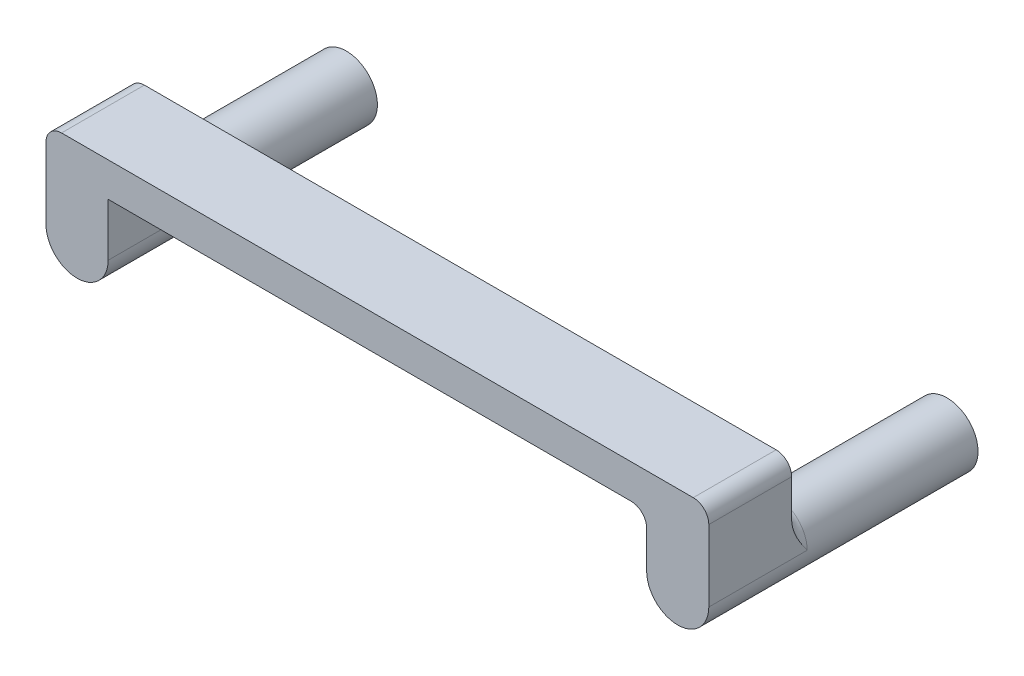
ISO-10303-21;
HEADER;
FILE_DESCRIPTION(('STEP AP214'),'2;1');
FILE_NAME('part.step','',(''),(''),'','','');
FILE_SCHEMA(('AUTOMOTIVE_DESIGN { 1 0 10303 214 1 1 1 1 }'));
ENDSEC;
DATA;
#1=APPLICATION_CONTEXT('core data for automotive mechanical design processes');
#2=APPLICATION_PROTOCOL_DEFINITION('international standard','automotive_design',2000,#1);
#3=PRODUCT_CONTEXT('',#1,'mechanical');
#4=PRODUCT('Part','Part','',(#3));
#5=PRODUCT_RELATED_PRODUCT_CATEGORY('part','',(#4));
#6=PRODUCT_DEFINITION_FORMATION('','',#4);
#7=PRODUCT_DEFINITION_CONTEXT('part definition',#1,'design');
#8=PRODUCT_DEFINITION('design','',#6,#7);
#9=PRODUCT_DEFINITION_SHAPE('','',#8);
#10=(LENGTH_UNIT() NAMED_UNIT(*) SI_UNIT(.MILLI.,.METRE.));
#11=(NAMED_UNIT(*) PLANE_ANGLE_UNIT() SI_UNIT($,.RADIAN.));
#12=(NAMED_UNIT(*) SI_UNIT($,.STERADIAN.) SOLID_ANGLE_UNIT());
#13=UNCERTAINTY_MEASURE_WITH_UNIT(LENGTH_MEASURE(1.E-05),#10,'distance_accuracy_value','');
#14=(GEOMETRIC_REPRESENTATION_CONTEXT(3) GLOBAL_UNCERTAINTY_ASSIGNED_CONTEXT((#13)) GLOBAL_UNIT_ASSIGNED_CONTEXT((#10,
#11,#12)) REPRESENTATION_CONTEXT('',''));
#15=CARTESIAN_POINT('',(0.,0.,0.));
#16=DIRECTION('',(0.,0.,1.));
#17=DIRECTION('',(1.,0.,0.));
#18=AXIS2_PLACEMENT_3D('',#15,#16,#17);
#19=CARTESIAN_POINT('',(-9.99999999999998,60.9,0.));
#20=DIRECTION('',(1.,0.,0.));
#21=DIRECTION('',(0.,0.,-1.));
#22=AXIS2_PLACEMENT_3D('',#19,#20,#21);
#23=PLANE('',#22);
#24=DIRECTION('',(0.,-1.,0.));
#25=VECTOR('',#24,1.);
#26=CARTESIAN_POINT('',(-9.99999999999999,60.9,-56.9370698042326));
#27=LINE('',#26,#25);
#28=CARTESIAN_POINT('',(-9.99999999999999,59.4,-56.9370698042326));
#29=VERTEX_POINT('',#28);
#30=CARTESIAN_POINT('',(-9.99999999999999,52.50000168,-56.9370698042326));
#31=VERTEX_POINT('',#30);
#32=EDGE_CURVE('E166',#29,#31,#27,.T.);
#33=ORIENTED_EDGE('',*,*,#32,.F.);
#34=DIRECTION('',(0.,0.,1.));
#35=VECTOR('',#34,1.);
#36=CARTESIAN_POINT('',(-10.,59.4,-64.9370698042326));
#37=LINE('',#36,#35);
#38=CARTESIAN_POINT('',(-10.,59.4,-64.9370698042326));
#39=VERTEX_POINT('',#38);
#40=EDGE_CURVE('E281',#29,#39,#37,.F.);
#41=ORIENTED_EDGE('',*,*,#40,.T.);
#42=DIRECTION('',(0.,-1.,0.));
#43=VECTOR('',#42,1.);
#44=CARTESIAN_POINT('',(-10.,60.9,-64.9370698042326));
#45=LINE('',#44,#43);
#46=CARTESIAN_POINT('',(-10.,55.8541049521128,-64.9370698042326));
#47=VERTEX_POINT('',#46);
#48=EDGE_CURVE('E246',#39,#47,#45,.T.);
#49=ORIENTED_EDGE('',*,*,#48,.T.);
#50=CARTESIAN_POINT('',(-10.,55.8541049521128,-64.9370698042326));
#51=CARTESIAN_POINT('',(-10.0000000000216,55.7651154626738,-64.9370745959461));
#52=CARTESIAN_POINT('',(-10.0000000000108,55.6762126022973,-64.9414664773992));
#53=CARTESIAN_POINT('',(-9.99999999998921,55.4992948734416,-64.9580952538092));
#54=CARTESIAN_POINT('',(-9.99999999997845,55.4112786786405,-64.9703177913225));
#55=CARTESIAN_POINT('',(-10.0000000000212,55.2378021048105,-65.0014552321768));
#56=CARTESIAN_POINT('',(-10.0000000000738,55.1523231740385,-65.0202692748518));
#57=CARTESIAN_POINT('',(-9.99999999992613,54.9828516014592,-65.0638136754254));
#58=CARTESIAN_POINT('',(-9.99999999972568,54.8988598912561,-65.0885476099306));
#59=CARTESIAN_POINT('',(-10.0000000005999,54.6338606954235,-65.1755873368162));
#60=CARTESIAN_POINT('',(-10.0000000034705,54.4560333562481,-65.2476423714991));
#61=CARTESIAN_POINT('',(-9.99999999652462,54.1086185838798,-65.4093753327334));
#62=CARTESIAN_POINT('',(-9.99999998669028,53.9390431356483,-65.4990779905247));
#63=CARTESIAN_POINT('',(-10.0000000134214,53.6054044645602,-65.691076549084));
#64=CARTESIAN_POINT('',(-10.0000000503772,53.4413994689193,-65.7934718496725));
#65=CARTESIAN_POINT('',(-9.99999994964333,53.1181729631041,-66.0052672807827));
#66=CARTESIAN_POINT('',(-9.99999981202489,52.9589495316917,-66.1146645410495));
#67=CARTESIAN_POINT('',(-10.0000000289543,52.7762311692729,-66.2423521131087));
#68=CARTESIAN_POINT('',(-10.0000000656336,52.7518643345087,-66.2594245923119));
#69=CARTESIAN_POINT('',(-9.99999993436467,52.7031942128421,-66.2936622887846));
#70=CARTESIAN_POINT('',(-9.99999976641105,52.6788909276215,-66.3108275084721));
#71=CARTESIAN_POINT('',(-10.0000002332627,52.6302228048735,-66.3449954933492));
#72=CARTESIAN_POINT('',(-10.0000008669469,52.6058581007391,-66.3619984519649));
#73=CARTESIAN_POINT('',(-9.99999913334557,52.5576012796665,-66.3966681153818));
#74=CARTESIAN_POINT('',(-9.9999967670724,52.5337090060455,-66.4143345942913));
#75=CARTESIAN_POINT('',(-10.0000003975836,52.5060856266609,-66.4330250808685));
#76=CARTESIAN_POINT('',(-10.0000008798491,52.5030498646338,-66.4350564394132));
#77=CARTESIAN_POINT('',(-10.00000146,52.50000168,-66.4370698042326));
#78=B_SPLINE_CURVE_WITH_KNOTS('',3,(#50,#51,#52,#53,#54,#55,#56,#57,#58,#59,#60,#61,#62,#63,#64,
#65,#66,#67,#68,#69,#70,#71,#72,#73,#74,#75,#76,#77),.UNSPECIFIED.,.F.,.F.,(4,2,2,2,2,2,2,2,2,2,
2,2,2,4),(0.,0.266735554078513,0.532983444887629,0.795323468027049,1.05782239037541,
1.63189767728831,2.20678327428957,2.78649511016045,3.36597081296184,3.45522892799344,
3.54448938162114,3.63362515636196,3.72273085562599,3.73368902329409),.UNSPECIFIED.);
#79=CARTESIAN_POINT('',(-10.,52.50000168,-66.4370698042326));
#80=VERTEX_POINT('',#79);
#81=EDGE_CURVE('E298',#47,#80,#78,.T.);
#82=ORIENTED_EDGE('',*,*,#81,.T.);
#83=DIRECTION('',(0.,0.,-1.));
#84=VECTOR('',#83,1.);
#85=CARTESIAN_POINT('',(-9.99999999999999,52.50000168,-56.9370698042326));
#86=LINE('',#85,#84);
#87=EDGE_CURVE('E179',#31,#80,#86,.T.);
#88=ORIENTED_EDGE('',*,*,#87,.F.);
#89=EDGE_LOOP('',(#33,#41,#49,#82,#88));
#90=FACE_BOUND('',#89,.T.);
#91=ADVANCED_FACE('F59',(#90),#23,.F.);
#92=CARTESIAN_POINT('',(0.,60.9,-56.9370698042326));
#93=DIRECTION('',(0.,0.,-1.));
#94=DIRECTION('',(0.,1.,0.));
#95=AXIS2_PLACEMENT_3D('',#92,#93,#94);
#96=PLANE('',#95);
#97=DIRECTION('',(1.,0.,0.));
#98=VECTOR('',#97,1.);
#99=CARTESIAN_POINT('',(0.,60.9,-56.9370698042326));
#100=LINE('',#99,#98);
#101=CARTESIAN_POINT('',(-8.49999999999999,60.9,-56.9370698042326));
#102=VERTEX_POINT('',#101);
#103=CARTESIAN_POINT('',(52.5,60.9,-56.9370698042326));
#104=VERTEX_POINT('',#103);
#105=EDGE_CURVE('E239',#102,#104,#100,.T.);
#106=ORIENTED_EDGE('',*,*,#105,.F.);
#107=CARTESIAN_POINT('',(-8.49999999999999,59.4,-56.9370698042326));
#108=DIRECTION('',(0.,0.,-1.));
#109=DIRECTION('',(0.,1.,0.));
#110=AXIS2_PLACEMENT_3D('',#107,#108,#109);
#111=CIRCLE('',#110,1.5);
#112=EDGE_CURVE('E279',#102,#29,#111,.F.);
#113=ORIENTED_EDGE('',*,*,#112,.T.);
#114=ORIENTED_EDGE('',*,*,#32,.T.);
#115=CARTESIAN_POINT('',(-7.00000145999998,52.50000168,-56.9370698042326));
#116=DIRECTION('',(0.,0.,-1.));
#117=DIRECTION('',(-1.,0.,0.));
#118=AXIS2_PLACEMENT_3D('',#115,#116,#117);
#119=CIRCLE('',#118,2.99999999999999);
#120=CARTESIAN_POINT('',(-4.00000000000002,52.50000168,-56.9370698042326));
#121=VERTEX_POINT('',#120);
#122=EDGE_CURVE('E186',#121,#31,#119,.T.);
#123=ORIENTED_EDGE('',*,*,#122,.F.);
#124=DIRECTION('',(0.,1.,0.));
#125=VECTOR('',#124,1.);
#126=CARTESIAN_POINT('',(-4.00000000000002,49.1,-56.9370698042326));
#127=LINE('',#126,#125);
#128=CARTESIAN_POINT('',(-4.00000000000002,57.6,-56.9370698042326));
#129=VERTEX_POINT('',#128);
#130=EDGE_CURVE('E211',#121,#129,#127,.T.);
#131=ORIENTED_EDGE('',*,*,#130,.T.);
#132=DIRECTION('',(1.,0.,0.));
#133=VECTOR('',#132,1.);
#134=CARTESIAN_POINT('',(0.,57.6,-56.9370698042326));
#135=LINE('',#134,#133);
#136=CARTESIAN_POINT('',(46.5,57.6,-56.9370698042326));
#137=VERTEX_POINT('',#136);
#138=EDGE_CURVE('E218',#129,#137,#135,.T.);
#139=ORIENTED_EDGE('',*,*,#138,.T.);
#140=CARTESIAN_POINT('',(46.5,56.1,-56.9370698042326));
#141=DIRECTION('',(0.,0.,-1.));
#142=DIRECTION('',(0.,1.,0.));
#143=AXIS2_PLACEMENT_3D('',#140,#141,#142);
#144=CIRCLE('',#143,1.5);
#145=CARTESIAN_POINT('',(48.,56.1,-56.9370698042326));
#146=VERTEX_POINT('',#145);
#147=EDGE_CURVE('E371',#137,#146,#144,.T.);
#148=ORIENTED_EDGE('',*,*,#147,.T.);
#149=DIRECTION('',(0.,1.,0.));
#150=VECTOR('',#149,1.);
#151=CARTESIAN_POINT('',(48.,49.1,-56.9370698042326));
#152=LINE('',#151,#150);
#153=CARTESIAN_POINT('',(48.,52.50000168,-56.9370698042326));
#154=VERTEX_POINT('',#153);
#155=EDGE_CURVE('E178',#154,#146,#152,.T.);
#156=ORIENTED_EDGE('',*,*,#155,.F.);
#157=CARTESIAN_POINT('',(50.99999938,52.50000168,-56.9370698042326));
#158=DIRECTION('',(0.,0.,-1.));
#159=DIRECTION('',(-1.,0.,0.));
#160=AXIS2_PLACEMENT_3D('',#157,#158,#159);
#161=CIRCLE('',#160,2.99999999999999);
#162=CARTESIAN_POINT('',(54.,52.50000168,-56.9370698042326));
#163=VERTEX_POINT('',#162);
#164=EDGE_CURVE('E170',#163,#154,#161,.T.);
#165=ORIENTED_EDGE('',*,*,#164,.F.);
#166=DIRECTION('',(0.,-1.,0.));
#167=VECTOR('',#166,1.);
#168=CARTESIAN_POINT('',(54.,60.9,-56.9370698042326));
#169=LINE('',#168,#167);
#170=CARTESIAN_POINT('',(54.,59.4,-56.9370698042326));
#171=VERTEX_POINT('',#170);
#172=EDGE_CURVE('E158',#171,#163,#169,.T.);
#173=ORIENTED_EDGE('',*,*,#172,.F.);
#174=CARTESIAN_POINT('',(52.5,59.4,-56.9370698042326));
#175=DIRECTION('',(0.,0.,-1.));
#176=DIRECTION('',(0.,1.,0.));
#177=AXIS2_PLACEMENT_3D('',#174,#175,#176);
#178=CIRCLE('',#177,1.5);
#179=EDGE_CURVE('E277',#171,#104,#178,.F.);
#180=ORIENTED_EDGE('',*,*,#179,.T.);
#181=EDGE_LOOP('',(#106,#113,#114,#123,#131,#139,#148,#156,#165,#173,#180));
#182=FACE_BOUND('',#181,.T.);
#183=ADVANCED_FACE('F176',(#182),#96,.F.);
#184=CARTESIAN_POINT('',(0.,57.6,0.));
#185=DIRECTION('',(0.,1.,0.));
#186=DIRECTION('',(0.,0.,1.));
#187=AXIS2_PLACEMENT_3D('',#184,#185,#186);
#188=PLANE('',#187);
#189=CARTESIAN_POINT('',(7.99999999999998,57.6,-60.9370698042326));
#190=DIRECTION('',(0.,1.,0.));
#191=DIRECTION('',(0.,0.,1.));
#192=AXIS2_PLACEMENT_3D('',#189,#190,#191);
#193=CIRCLE('',#192,2.55);
#194=CARTESIAN_POINT('',(7.99999999999998,57.6,-58.3870698042326));
#195=VERTEX_POINT('',#194);
#196=EDGE_CURVE('E203',#195,#195,#193,.T.);
#197=ORIENTED_EDGE('',*,*,#196,.T.);
#198=EDGE_LOOP('',(#197));
#199=FACE_BOUND('',#198,.T.);
#200=CARTESIAN_POINT('',(24.,57.6,-60.9370698042326));
#201=DIRECTION('',(0.,1.,0.));
#202=DIRECTION('',(0.,0.,1.));
#203=AXIS2_PLACEMENT_3D('',#200,#201,#202);
#204=CIRCLE('',#203,2.54999999999999);
#205=CARTESIAN_POINT('',(24.,57.6,-58.3870698042326));
#206=VERTEX_POINT('',#205);
#207=EDGE_CURVE('E231',#206,#206,#204,.T.);
#208=ORIENTED_EDGE('',*,*,#207,.T.);
#209=EDGE_LOOP('',(#208));
#210=FACE_BOUND('',#209,.T.);
#211=CARTESIAN_POINT('',(16.,57.6,-60.9370698042326));
#212=DIRECTION('',(0.,1.,0.));
#213=DIRECTION('',(0.,0.,1.));
#214=AXIS2_PLACEMENT_3D('',#211,#212,#213);
#215=CIRCLE('',#214,2.54999999999999);
#216=CARTESIAN_POINT('',(16.,57.6,-58.3870698042326));
#217=VERTEX_POINT('',#216);
#218=EDGE_CURVE('E225',#217,#217,#215,.T.);
#219=ORIENTED_EDGE('',*,*,#218,.T.);
#220=EDGE_LOOP('',(#219));
#221=FACE_BOUND('',#220,.T.);
#222=CARTESIAN_POINT('',(0.,57.6,-60.9370698042326));
#223=DIRECTION('',(0.,1.,0.));
#224=DIRECTION('',(0.,0.,1.));
#225=AXIS2_PLACEMENT_3D('',#222,#223,#224);
#226=CIRCLE('',#225,2.55);
#227=CARTESIAN_POINT('',(0.,57.6,-58.3870698042326));
#228=VERTEX_POINT('',#227);
#229=EDGE_CURVE('E219',#228,#228,#226,.T.);
#230=ORIENTED_EDGE('',*,*,#229,.T.);
#231=EDGE_LOOP('',(#230));
#232=FACE_BOUND('',#231,.T.);
#233=DIRECTION('',(-1.,0.,0.));
#234=VECTOR('',#233,1.);
#235=CARTESIAN_POINT('',(0.,57.6,-64.9370698042326));
#236=LINE('',#235,#234);
#237=CARTESIAN_POINT('',(46.5,57.6,-64.9370698042326));
#238=VERTEX_POINT('',#237);
#239=CARTESIAN_POINT('',(-4.00000000000002,57.6,-64.9370698042326));
#240=VERTEX_POINT('',#239);
#241=EDGE_CURVE('E243',#238,#240,#236,.T.);
#242=ORIENTED_EDGE('',*,*,#241,.F.);
#243=DIRECTION('',(0.,0.,1.));
#244=VECTOR('',#243,1.);
#245=CARTESIAN_POINT('',(46.5,57.6,0.));
#246=LINE('',#245,#244);
#247=EDGE_CURVE('E283',#238,#137,#246,.T.);
#248=ORIENTED_EDGE('',*,*,#247,.T.);
#249=ORIENTED_EDGE('',*,*,#138,.F.);
#250=DIRECTION('',(0.,0.,1.));
#251=VECTOR('',#250,1.);
#252=CARTESIAN_POINT('',(-4.00000000000001,57.6,0.));
#253=LINE('',#252,#251);
#254=EDGE_CURVE('E208',#240,#129,#253,.T.);
#255=ORIENTED_EDGE('',*,*,#254,.F.);
#256=EDGE_LOOP('',(#242,#248,#249,#255));
#257=FACE_BOUND('',#256,.T.);
#258=ADVANCED_FACE('F353',(#199,#210,#221,#232,#257),#188,.F.);
#259=CARTESIAN_POINT('',(54.,60.9,0.));
#260=DIRECTION('',(-1.,0.,0.));
#261=DIRECTION('',(0.,-1.,0.));
#262=AXIS2_PLACEMENT_3D('',#259,#260,#261);
#263=PLANE('',#262);
#264=DIRECTION('',(0.,-1.,0.));
#265=VECTOR('',#264,1.);
#266=CARTESIAN_POINT('',(54.,60.9,-64.9370698042326));
#267=LINE('',#266,#265);
#268=CARTESIAN_POINT('',(54.,59.4,-64.9370698042326));
#269=VERTEX_POINT('',#268);
#270=CARTESIAN_POINT('',(54.,55.8541030917047,-64.9370698042326));
#271=VERTEX_POINT('',#270);
#272=EDGE_CURVE('E167',#269,#271,#267,.T.);
#273=ORIENTED_EDGE('',*,*,#272,.F.);
#274=DIRECTION('',(0.,0.,-1.));
#275=VECTOR('',#274,1.);
#276=CARTESIAN_POINT('',(54.,59.4,-56.9370698042326));
#277=LINE('',#276,#275);
#278=EDGE_CURVE('E162',#269,#171,#277,.F.);
#279=ORIENTED_EDGE('',*,*,#278,.T.);
#280=ORIENTED_EDGE('',*,*,#172,.T.);
#281=DIRECTION('',(0.,0.,-1.));
#282=VECTOR('',#281,1.);
#283=CARTESIAN_POINT('',(54.,52.50000168,-56.9370698042326));
#284=LINE('',#283,#282);
#285=CARTESIAN_POINT('',(53.99999938,52.50000168,-66.4370698042326));
#286=VERTEX_POINT('',#285);
#287=EDGE_CURVE('E80',#163,#286,#284,.T.);
#288=ORIENTED_EDGE('',*,*,#287,.T.);
#289=CARTESIAN_POINT('',(54.,55.8541030917047,-64.9370698042326));
#290=CARTESIAN_POINT('',(53.9999999999299,55.7649733970403,-64.9370775192363));
#291=CARTESIAN_POINT('',(53.999999999965,55.6759502171737,-64.9414804885947));
#292=CARTESIAN_POINT('',(54.0000000000349,55.4988075061717,-64.9581513652741));
#293=CARTESIAN_POINT('',(54.0000000000698,55.4106865405372,-64.9704037644139));
#294=CARTESIAN_POINT('',(53.9999999998629,55.1512614462883,-65.0170274504587));
#295=CARTESIAN_POINT('',(53.9999999993218,54.9817295342731,-65.0613340130898));
#296=CARTESIAN_POINT('',(54.000000000743,54.6338210996999,-65.1755928245347));
#297=CARTESIAN_POINT('',(54.0000000029495,54.4561468019654,-65.2475906689021));
#298=CARTESIAN_POINT('',(53.9999999970466,54.1089486349843,-65.409217312076));
#299=CARTESIAN_POINT('',(53.9999999889238,53.9394356942274,-65.4988689755974));
#300=CARTESIAN_POINT('',(54.0000000111813,53.6057558422819,-65.6908516566308));
#301=CARTESIAN_POINT('',(54.0000000419277,53.4416549306939,-65.7932949264405));
#302=CARTESIAN_POINT('',(53.9999999790474,53.199103813002,-65.9522339551471));
#303=CARTESIAN_POINT('',(53.9999999399459,53.1188745838168,-66.0060774567921));
#304=CARTESIAN_POINT('',(54.0000000600628,52.9591714614304,-66.114903188384));
#305=CARTESIAN_POINT('',(54.00000021931,52.879697678832,-66.1698855814378));
#306=CARTESIAN_POINT('',(53.9999998649995,52.7518402262862,-66.2594732705201));
#307=CARTESIAN_POINT('',(53.9999995865541,52.7032497511025,-66.2937864676519));
#308=CARTESIAN_POINT('',(54.0000004129331,52.6058539646026,-66.3619868454116));
#309=CARTESIAN_POINT('',(54.0000015160425,52.5570489944726,-66.3958745016181));
#310=CARTESIAN_POINT('',(53.9999999068176,52.5059160502994,-66.4327849127886));
#311=CARTESIAN_POINT('',(53.9999998037404,52.5029575802532,-66.4349255609355));
#312=CARTESIAN_POINT('',(53.99999969,52.50000168,-66.4370698042326));
#313=B_SPLINE_CURVE_WITH_KNOTS('',3,(#289,#290,#291,#292,#293,#294,#295,#296,#297,#298,#299,
#300,#301,#302,#303,#304,#305,#306,#307,#308,#309,#310,#311,#312),.UNSPECIFIED.,.F.,.F.,(4,2,2,
2,2,2,2,2,2,2,2,4),(0.,0.267116215524851,0.533706308145122,1.05750527589403,1.63134288088779,
2.20592865091704,2.78596720148883,3.0758305440119,3.36573569047433,3.54419240282973,
3.7224277880146,3.73338289242754),.UNSPECIFIED.);
#314=EDGE_CURVE('E73',#286,#271,#313,.F.);
#315=ORIENTED_EDGE('',*,*,#314,.T.);
#316=EDGE_LOOP('',(#273,#279,#280,#288,#315));
#317=FACE_BOUND('',#316,.T.);
#318=ADVANCED_FACE('F160',(#317),#263,.F.);
#319=CARTESIAN_POINT('',(0.,60.9,-64.9370698042326));
#320=DIRECTION('',(0.,0.,1.));
#321=DIRECTION('',(1.,0.,0.));
#322=AXIS2_PLACEMENT_3D('',#319,#320,#321);
#323=PLANE('',#322);
#324=DIRECTION('',(0.,1.,0.));
#325=VECTOR('',#324,1.);
#326=CARTESIAN_POINT('',(-4.00000000000002,49.1,-64.9370698042326));
#327=LINE('',#326,#325);
#328=CARTESIAN_POINT('',(-4.00000000000002,55.8541023403854,-64.9370698042326));
#329=VERTEX_POINT('',#328);
#330=EDGE_CURVE('E207',#329,#240,#327,.T.);
#331=ORIENTED_EDGE('',*,*,#330,.F.);
#332=CARTESIAN_POINT('',(-7.00000145999998,52.50000168,-64.9370698042326));
#333=DIRECTION('',(0.,0.,1.));
#334=DIRECTION('',(1.,0.,0.));
#335=AXIS2_PLACEMENT_3D('',#332,#333,#334);
#336=CIRCLE('',#335,4.49999999999999);
#337=EDGE_CURVE('E269',#329,#47,#336,.T.);
#338=ORIENTED_EDGE('',*,*,#337,.T.);
#339=ORIENTED_EDGE('',*,*,#48,.F.);
#340=CARTESIAN_POINT('',(-8.5,59.4,-64.9370698042326));
#341=DIRECTION('',(0.,0.,1.));
#342=DIRECTION('',(1.,0.,0.));
#343=AXIS2_PLACEMENT_3D('',#340,#341,#342);
#344=CIRCLE('',#343,1.5);
#345=CARTESIAN_POINT('',(-8.5,60.9,-64.9370698042326));
#346=VERTEX_POINT('',#345);
#347=EDGE_CURVE('E267',#39,#346,#344,.F.);
#348=ORIENTED_EDGE('',*,*,#347,.T.);
#349=DIRECTION('',(-1.,0.,0.));
#350=VECTOR('',#349,1.);
#351=CARTESIAN_POINT('',(0.,60.9,-64.9370698042326));
#352=LINE('',#351,#350);
#353=CARTESIAN_POINT('',(52.5,60.9,-64.9370698042326));
#354=VERTEX_POINT('',#353);
#355=EDGE_CURVE('E242',#354,#346,#352,.T.);
#356=ORIENTED_EDGE('',*,*,#355,.F.);
#357=CARTESIAN_POINT('',(52.5,59.4,-64.9370698042326));
#358=DIRECTION('',(0.,0.,1.));
#359=DIRECTION('',(1.,0.,0.));
#360=AXIS2_PLACEMENT_3D('',#357,#358,#359);
#361=CIRCLE('',#360,1.5);
#362=EDGE_CURVE('E265',#354,#269,#361,.F.);
#363=ORIENTED_EDGE('',*,*,#362,.T.);
#364=ORIENTED_EDGE('',*,*,#272,.T.);
#365=CARTESIAN_POINT('',(50.99999938,52.50000168,-64.9370698042326));
#366=DIRECTION('',(0.,0.,1.));
#367=DIRECTION('',(1.,0.,0.));
#368=AXIS2_PLACEMENT_3D('',#365,#366,#367);
#369=CIRCLE('',#368,4.49999999999999);
#370=CARTESIAN_POINT('',(48.,55.8541042007944,-64.9370698042326));
#371=VERTEX_POINT('',#370);
#372=EDGE_CURVE('E263',#271,#371,#369,.T.);
#373=ORIENTED_EDGE('',*,*,#372,.T.);
#374=DIRECTION('',(0.,1.,0.));
#375=VECTOR('',#374,1.);
#376=CARTESIAN_POINT('',(48.,49.1,-64.9370698042326));
#377=LINE('',#376,#375);
#378=CARTESIAN_POINT('',(48.,56.1,-64.9370698042326));
#379=VERTEX_POINT('',#378);
#380=EDGE_CURVE('E204',#371,#379,#377,.T.);
#381=ORIENTED_EDGE('',*,*,#380,.T.);
#382=CARTESIAN_POINT('',(46.5,56.1,-64.9370698042326));
#383=DIRECTION('',(0.,0.,1.));
#384=DIRECTION('',(1.,0.,0.));
#385=AXIS2_PLACEMENT_3D('',#382,#383,#384);
#386=CIRCLE('',#385,1.5);
#387=EDGE_CURVE('E370',#379,#238,#386,.T.);
#388=ORIENTED_EDGE('',*,*,#387,.T.);
#389=ORIENTED_EDGE('',*,*,#241,.T.);
#390=EDGE_LOOP('',(#331,#338,#339,#348,#356,#363,#364,#373,#381,#388,#389));
#391=FACE_BOUND('',#390,.T.);
#392=ADVANCED_FACE('F351',(#391),#323,.F.);
#393=CARTESIAN_POINT('',(0.,60.9,0.));
#394=DIRECTION('',(0.,1.,0.));
#395=DIRECTION('',(0.,0.,1.));
#396=AXIS2_PLACEMENT_3D('',#393,#394,#395);
#397=PLANE('',#396);
#398=ORIENTED_EDGE('',*,*,#355,.T.);
#399=DIRECTION('',(0.,0.,1.));
#400=VECTOR('',#399,1.);
#401=CARTESIAN_POINT('',(-8.49999999999999,60.9,-56.9370698042326));
#402=LINE('',#401,#400);
#403=EDGE_CURVE('E274',#346,#102,#402,.T.);
#404=ORIENTED_EDGE('',*,*,#403,.T.);
#405=ORIENTED_EDGE('',*,*,#105,.T.);
#406=DIRECTION('',(0.,0.,-1.));
#407=VECTOR('',#406,1.);
#408=CARTESIAN_POINT('',(52.5,60.9,-64.9370698042326));
#409=LINE('',#408,#407);
#410=EDGE_CURVE('E271',#104,#354,#409,.T.);
#411=ORIENTED_EDGE('',*,*,#410,.T.);
#412=EDGE_LOOP('',(#398,#404,#405,#411));
#413=FACE_BOUND('',#412,.T.);
#414=ADVANCED_FACE('F347',(#413),#397,.T.);
#415=CARTESIAN_POINT('',(7.99999999999998,59.4,-60.9370698042326));
#416=DIRECTION('',(0.,-1.,0.));
#417=DIRECTION('',(0.,0.,-1.));
#418=AXIS2_PLACEMENT_3D('',#415,#416,#417);
#419=CYLINDRICAL_SURFACE('',#418,2.55);
#420=CARTESIAN_POINT('',(7.99999999999998,59.4,-60.9370698042326));
#421=DIRECTION('',(0.,1.,0.));
#422=DIRECTION('',(0.,0.,1.));
#423=AXIS2_PLACEMENT_3D('',#420,#421,#422);
#424=CIRCLE('',#423,2.55);
#425=CARTESIAN_POINT('',(7.99999999999998,59.4,-58.3870698042326));
#426=VERTEX_POINT('',#425);
#427=EDGE_CURVE('E234',#426,#426,#424,.T.);
#428=ORIENTED_EDGE('',*,*,#427,.T.);
#429=EDGE_LOOP('',(#428));
#430=FACE_BOUND('',#429,.T.);
#431=ORIENTED_EDGE('',*,*,#196,.F.);
#432=EDGE_LOOP('',(#431));
#433=FACE_BOUND('',#432,.T.);
#434=ADVANCED_FACE('F343',(#430,#433),#419,.F.);
#435=CARTESIAN_POINT('',(0.,59.4,0.));
#436=DIRECTION('',(0.,1.,0.));
#437=DIRECTION('',(0.,0.,1.));
#438=AXIS2_PLACEMENT_3D('',#435,#436,#437);
#439=PLANE('',#438);
#440=ORIENTED_EDGE('',*,*,#427,.F.);
#441=EDGE_LOOP('',(#440));
#442=FACE_BOUND('',#441,.T.);
#443=ADVANCED_FACE('F339',(#442),#439,.F.);
#444=CARTESIAN_POINT('',(24.,59.4,-60.9370698042326));
#445=DIRECTION('',(0.,-1.,0.));
#446=DIRECTION('',(0.,0.,-1.));
#447=AXIS2_PLACEMENT_3D('',#444,#445,#446);
#448=CYLINDRICAL_SURFACE('',#447,2.54999999999999);
#449=CARTESIAN_POINT('',(24.,59.4,-60.9370698042326));
#450=DIRECTION('',(0.,1.,0.));
#451=DIRECTION('',(0.,0.,1.));
#452=AXIS2_PLACEMENT_3D('',#449,#450,#451);
#453=CIRCLE('',#452,2.54999999999999);
#454=CARTESIAN_POINT('',(24.,59.4,-58.3870698042326));
#455=VERTEX_POINT('',#454);
#456=EDGE_CURVE('E228',#455,#455,#453,.T.);
#457=ORIENTED_EDGE('',*,*,#456,.T.);
#458=EDGE_LOOP('',(#457));
#459=FACE_BOUND('',#458,.T.);
#460=ORIENTED_EDGE('',*,*,#207,.F.);
#461=EDGE_LOOP('',(#460));
#462=FACE_BOUND('',#461,.T.);
#463=ADVANCED_FACE('F335',(#459,#462),#448,.F.);
#464=CARTESIAN_POINT('',(0.,59.4,0.));
#465=DIRECTION('',(0.,1.,0.));
#466=DIRECTION('',(0.,0.,1.));
#467=AXIS2_PLACEMENT_3D('',#464,#465,#466);
#468=PLANE('',#467);
#469=ORIENTED_EDGE('',*,*,#456,.F.);
#470=EDGE_LOOP('',(#469));
#471=FACE_BOUND('',#470,.T.);
#472=ADVANCED_FACE('F331',(#471),#468,.F.);
#473=CARTESIAN_POINT('',(16.,59.4,-60.9370698042326));
#474=DIRECTION('',(0.,-1.,0.));
#475=DIRECTION('',(0.,0.,-1.));
#476=AXIS2_PLACEMENT_3D('',#473,#474,#475);
#477=CYLINDRICAL_SURFACE('',#476,2.54999999999999);
#478=CARTESIAN_POINT('',(16.,59.4,-60.9370698042326));
#479=DIRECTION('',(0.,1.,0.));
#480=DIRECTION('',(0.,0.,1.));
#481=AXIS2_PLACEMENT_3D('',#478,#479,#480);
#482=CIRCLE('',#481,2.54999999999999);
#483=CARTESIAN_POINT('',(16.,59.4,-58.3870698042326));
#484=VERTEX_POINT('',#483);
#485=EDGE_CURVE('E222',#484,#484,#482,.T.);
#486=ORIENTED_EDGE('',*,*,#485,.T.);
#487=EDGE_LOOP('',(#486));
#488=FACE_BOUND('',#487,.T.);
#489=ORIENTED_EDGE('',*,*,#218,.F.);
#490=EDGE_LOOP('',(#489));
#491=FACE_BOUND('',#490,.T.);
#492=ADVANCED_FACE('F327',(#488,#491),#477,.F.);
#493=CARTESIAN_POINT('',(0.,59.4,0.));
#494=DIRECTION('',(0.,1.,0.));
#495=DIRECTION('',(0.,0.,1.));
#496=AXIS2_PLACEMENT_3D('',#493,#494,#495);
#497=PLANE('',#496);
#498=ORIENTED_EDGE('',*,*,#485,.F.);
#499=EDGE_LOOP('',(#498));
#500=FACE_BOUND('',#499,.T.);
#501=ADVANCED_FACE('F323',(#500),#497,.F.);
#502=CARTESIAN_POINT('',(0.,59.4,-60.9370698042326));
#503=DIRECTION('',(0.,-1.,0.));
#504=DIRECTION('',(0.,0.,-1.));
#505=AXIS2_PLACEMENT_3D('',#502,#503,#504);
#506=CYLINDRICAL_SURFACE('',#505,2.55);
#507=CARTESIAN_POINT('',(0.,59.4,-60.9370698042326));
#508=DIRECTION('',(0.,1.,0.));
#509=DIRECTION('',(0.,0.,1.));
#510=AXIS2_PLACEMENT_3D('',#507,#508,#509);
#511=CIRCLE('',#510,2.55);
#512=CARTESIAN_POINT('',(0.,59.4,-58.3870698042326));
#513=VERTEX_POINT('',#512);
#514=EDGE_CURVE('E215',#513,#513,#511,.T.);
#515=ORIENTED_EDGE('',*,*,#514,.T.);
#516=EDGE_LOOP('',(#515));
#517=FACE_BOUND('',#516,.T.);
#518=ORIENTED_EDGE('',*,*,#229,.F.);
#519=EDGE_LOOP('',(#518));
#520=FACE_BOUND('',#519,.T.);
#521=ADVANCED_FACE('F319',(#517,#520),#506,.F.);
#522=CARTESIAN_POINT('',(0.,59.4,0.));
#523=DIRECTION('',(0.,1.,0.));
#524=DIRECTION('',(0.,0.,1.));
#525=AXIS2_PLACEMENT_3D('',#522,#523,#524);
#526=PLANE('',#525);
#527=ORIENTED_EDGE('',*,*,#514,.F.);
#528=EDGE_LOOP('',(#527));
#529=FACE_BOUND('',#528,.T.);
#530=ADVANCED_FACE('F313',(#529),#526,.F.);
#531=CARTESIAN_POINT('',(-4.00000000000001,49.1,0.));
#532=DIRECTION('',(-1.,0.,0.));
#533=DIRECTION('',(0.,0.,1.));
#534=AXIS2_PLACEMENT_3D('',#531,#532,#533);
#535=PLANE('',#534);
#536=ORIENTED_EDGE('',*,*,#130,.F.);
#537=DIRECTION('',(0.,0.,-1.));
#538=VECTOR('',#537,1.);
#539=CARTESIAN_POINT('',(-4.00000000000002,52.50000168,-56.9370698042326));
#540=LINE('',#539,#538);
#541=CARTESIAN_POINT('',(-4.00000145999999,52.50000168,-66.4370698042326));
#542=VERTEX_POINT('',#541);
#543=EDGE_CURVE('E181',#121,#542,#540,.T.);
#544=ORIENTED_EDGE('',*,*,#543,.T.);
#545=CARTESIAN_POINT('',(-4.00000000000002,55.8541023403854,-64.9370698042326));
#546=CARTESIAN_POINT('',(-3.9999999999157,55.7649237703664,-64.9370774904815));
#547=CARTESIAN_POINT('',(-3.9999999999579,55.6758519420742,-64.9414852958209));
#548=CARTESIAN_POINT('',(-4.00000000004206,55.4986100878195,-64.9581742351931));
#549=CARTESIAN_POINT('',(-4.00000000008401,55.4104386503189,-64.970440117045));
#550=CARTESIAN_POINT('',(-3.99999999983518,55.1510651667753,-65.0170783769818));
#551=CARTESIAN_POINT('',(-3.99999999918523,54.9816325127578,-65.0613650023959));
#552=CARTESIAN_POINT('',(-4.00000000089282,54.6338884602661,-65.1755709110929));
#553=CARTESIAN_POINT('',(-4.00000000354427,54.4562802335919,-65.2475384569113));
#554=CARTESIAN_POINT('',(-3.9999999964501,54.1091516314353,-65.4091115937551));
#555=CARTESIAN_POINT('',(-3.99999998668465,53.9396446377411,-65.4987451943656));
#556=CARTESIAN_POINT('',(-4.00000001344658,53.6059368566374,-65.6907488152443));
#557=CARTESIAN_POINT('',(-4.00000005043102,53.4418048048098,-65.7932356225344));
#558=CARTESIAN_POINT('',(-3.99999994959707,53.1182981171148,-66.0051412656646));
#559=CARTESIAN_POINT('',(-3.99999981187587,52.9589208864878,-66.1145562150362));
#560=CARTESIAN_POINT('',(-4.00000002894946,52.7761580261159,-66.2423994995065));
#561=CARTESIAN_POINT('',(-4.00000006561509,52.7518077425804,-66.259481629987));
#562=CARTESIAN_POINT('',(-3.99999993438122,52.7031079846168,-66.2936514814355));
#563=CARTESIAN_POINT('',(-3.9999997664701,52.6787585103136,-66.3107392026662));
#564=CARTESIAN_POINT('',(-4.00000023319297,52.6302365539842,-66.3450873177354));
#565=CARTESIAN_POINT('',(-4.00000086666931,52.606063867268,-66.3623474268433));
#566=CARTESIAN_POINT('',(-3.99999913362153,52.557283272664,-66.3962471167872));
#567=CARTESIAN_POINT('',(-3.99999676810397,52.5326755135326,-66.4128869038929));
#568=CARTESIAN_POINT('',(-4.00000039756316,52.5058452655431,-66.4326851439364));
#569=CARTESIAN_POINT('',(-4.00000087982657,52.5029171791792,-66.4348687781205));
#570=CARTESIAN_POINT('',(-4.00000145999999,52.50000168,-66.4370698042326));
#571=B_SPLINE_CURVE_WITH_KNOTS('',3,(#545,#546,#547,#548,#549,#550,#551,#552,#553,#554,#555,
#556,#557,#558,#559,#560,#561,#562,#563,#564,#565,#566,#567,#568,#569,#570),.UNSPECIFIED.,.F.,
.F.,(4,2,2,2,2,2,2,2,2,2,2,2,4),(0.,0.267262314585604,0.534007449967324,1.05750641351278,
1.63112912379317,2.20566873904396,2.78586912831451,3.36574687855583,3.4549812279602,
3.54422065144852,3.63333130927452,3.722412066766,3.7333701003423),.UNSPECIFIED.);
#572=EDGE_CURVE('E290',#542,#329,#571,.F.);
#573=ORIENTED_EDGE('',*,*,#572,.T.);
#574=ORIENTED_EDGE('',*,*,#330,.T.);
#575=ORIENTED_EDGE('',*,*,#254,.T.);
#576=EDGE_LOOP('',(#536,#544,#573,#574,#575));
#577=FACE_BOUND('',#576,.T.);
#578=ADVANCED_FACE('F308',(#577),#535,.F.);
#579=CARTESIAN_POINT('',(48.,49.1,0.));
#580=DIRECTION('',(-1.,0.,0.));
#581=DIRECTION('',(0.,-1.,0.));
#582=AXIS2_PLACEMENT_3D('',#579,#580,#581);
#583=PLANE('',#582);
#584=ORIENTED_EDGE('',*,*,#155,.T.);
#585=DIRECTION('',(0.,0.,1.));
#586=VECTOR('',#585,1.);
#587=CARTESIAN_POINT('',(48.,56.1,0.));
#588=LINE('',#587,#586);
#589=EDGE_CURVE('E286',#146,#379,#588,.F.);
#590=ORIENTED_EDGE('',*,*,#589,.T.);
#591=ORIENTED_EDGE('',*,*,#380,.F.);
#592=CARTESIAN_POINT('',(48.,55.8541042007944,-64.9370698042326));
#593=CARTESIAN_POINT('',(47.99999999993,55.7650450111782,-64.9370774510909));
#594=CARTESIAN_POINT('',(47.9999999999651,55.6760921492964,-64.9414734946423));
#595=CARTESIAN_POINT('',(48.0000000000349,55.4990927715212,-64.9581184036118));
#596=CARTESIAN_POINT('',(48.0000000000697,55.4110447878148,-64.9703513890062));
#597=CARTESIAN_POINT('',(47.9999999998629,55.1515448738534,-65.0169536713615));
#598=CARTESIAN_POINT('',(47.9999999993209,54.9818688373738,-65.0612881776291));
#599=CARTESIAN_POINT('',(48.0000000007435,54.6337837527024,-65.1756062892671));
#600=CARTESIAN_POINT('',(48.0000000029506,54.4560731549745,-65.2476240628005));
#601=CARTESIAN_POINT('',(47.9999999970451,54.1087728838865,-65.4093019610118));
#602=CARTESIAN_POINT('',(47.9999999889174,53.9391954586686,-65.4989877158033));
#603=CARTESIAN_POINT('',(48.0000000111796,53.6055334561126,-65.6910026727145));
#604=CARTESIAN_POINT('',(48.000000041907,53.4415099280139,-65.7934356430775));
#605=CARTESIAN_POINT('',(47.999999979055,53.1990040113747,-65.9522811763076));
#606=CARTESIAN_POINT('',(47.999999939966,53.1187728102668,-66.0060842899967));
#607=CARTESIAN_POINT('',(48.0000000600343,52.9591809075931,-66.114968725185));
#608=CARTESIAN_POINT('',(48.0000002191926,52.8798202099926,-66.1700500525035));
#609=CARTESIAN_POINT('',(47.9999998650086,52.7518019917616,-66.2593599687299));
#610=CARTESIAN_POINT('',(47.9999995865162,52.7030609747964,-66.2934708786069));
#611=CARTESIAN_POINT('',(48.0000004129787,52.6060933415023,-66.3623001302075));
#612=CARTESIAN_POINT('',(48.0000015162442,52.5578661695815,-66.3970176790993));
#613=CARTESIAN_POINT('',(47.9999999068165,52.5060133469757,-66.4329225134461));
#614=CARTESIAN_POINT('',(47.9999998037393,52.5030087895543,-66.4349979835784));
#615=CARTESIAN_POINT('',(47.99999969,52.50000168,-66.4370698042326));
#616=B_SPLINE_CURVE_WITH_KNOTS('',3,(#592,#593,#594,#595,#596,#597,#598,#599,#600,#601,#602,
#603,#604,#605,#606,#607,#608,#609,#610,#611,#612,#613,#614,#615),.UNSPECIFIED.,.F.,.F.,(4,2,2,
2,2,2,2,2,2,2,2,4),(0.,0.266905180196714,0.533271232762391,1.05750361034496,1.63146573908575,
2.20626670182539,2.78609741408243,3.07589553329784,3.36569497212429,3.54417012089832,
3.72242727310553,3.73338238696271),.UNSPECIFIED.);
#617=CARTESIAN_POINT('',(48.,52.50000168,-66.4370698042326));
#618=VERTEX_POINT('',#617);
#619=EDGE_CURVE('E12',#371,#618,#616,.T.);
#620=ORIENTED_EDGE('',*,*,#619,.T.);
#621=DIRECTION('',(0.,0.,-1.));
#622=VECTOR('',#621,1.);
#623=CARTESIAN_POINT('',(48.,52.50000168,-56.9370698042326));
#624=LINE('',#623,#622);
#625=EDGE_CURVE('E88',#154,#618,#624,.T.);
#626=ORIENTED_EDGE('',*,*,#625,.F.);
#627=EDGE_LOOP('',(#584,#590,#591,#620,#626));
#628=FACE_BOUND('',#627,.T.);
#629=ADVANCED_FACE('F312',(#628),#583,.T.);
#630=CARTESIAN_POINT('',(-7.00000145999999,52.50000168,-91.4223511784711));
#631=DIRECTION('',(0.,0.,1.));
#632=DIRECTION('',(1.,0.,0.));
#633=AXIS2_PLACEMENT_3D('',#630,#631,#632);
#634=CYLINDRICAL_SURFACE('',#633,2.24999999999999);
#635=CARTESIAN_POINT('',(-7.00000145999999,52.50000168,-82.9370698042326));
#636=DIRECTION('',(0.,0.,-1.));
#637=DIRECTION('',(-1.,0.,0.));
#638=AXIS2_PLACEMENT_3D('',#635,#636,#637);
#639=CIRCLE('',#638,2.24999999999999);
#640=CARTESIAN_POINT('',(-9.25000145999998,52.50000168,-82.9370698042326));
#641=VERTEX_POINT('',#640);
#642=EDGE_CURVE('E184',#641,#641,#639,.T.);
#643=ORIENTED_EDGE('',*,*,#642,.T.);
#644=EDGE_LOOP('',(#643));
#645=FACE_BOUND('',#644,.T.);
#646=CARTESIAN_POINT('',(-7.00000145999998,52.50000168,-64.9370698042326));
#647=DIRECTION('',(0.,0.,1.));
#648=DIRECTION('',(1.,0.,0.));
#649=AXIS2_PLACEMENT_3D('',#646,#647,#648);
#650=CIRCLE('',#649,2.24999999999999);
#651=CARTESIAN_POINT('',(-4.75000145999999,52.50000168,-64.9370698042326));
#652=VERTEX_POINT('',#651);
#653=EDGE_CURVE('E193',#652,#652,#650,.F.);
#654=ORIENTED_EDGE('',*,*,#653,.F.);
#655=EDGE_LOOP('',(#654));
#656=FACE_BOUND('',#655,.T.);
#657=ADVANCED_FACE('F458',(#645,#656),#634,.F.);
#658=CARTESIAN_POINT('',(-7.00000145999999,52.50000168,-91.4223511784711));
#659=DIRECTION('',(0.,0.,1.));
#660=DIRECTION('',(1.,0.,0.));
#661=AXIS2_PLACEMENT_3D('',#658,#659,#660);
#662=CYLINDRICAL_SURFACE('',#661,2.99999999999999);
#663=CARTESIAN_POINT('',(-7.00000145999999,52.50000168,-82.9370698042326));
#664=DIRECTION('',(0.,0.,-1.));
#665=DIRECTION('',(-1.,0.,0.));
#666=AXIS2_PLACEMENT_3D('',#663,#664,#665);
#667=CIRCLE('',#666,2.99999999999999);
#668=CARTESIAN_POINT('',(-10.00000146,52.50000168,-82.9370698042326));
#669=VERTEX_POINT('',#668);
#670=EDGE_CURVE('E197',#669,#669,#667,.T.);
#671=ORIENTED_EDGE('',*,*,#670,.F.);
#672=EDGE_LOOP('',(#671));
#673=FACE_BOUND('',#672,.T.);
#674=CARTESIAN_POINT('',(-7.00000145999998,52.50000168,-66.4370698042326));
#675=DIRECTION('',(0.,0.,1.));
#676=DIRECTION('',(1.,0.,0.));
#677=AXIS2_PLACEMENT_3D('',#674,#675,#676);
#678=CIRCLE('',#677,2.99999999999999);
#679=EDGE_CURVE('E256',#80,#542,#678,.F.);
#680=ORIENTED_EDGE('',*,*,#679,.T.);
#681=ORIENTED_EDGE('',*,*,#543,.F.);
#682=ORIENTED_EDGE('',*,*,#122,.T.);
#683=ORIENTED_EDGE('',*,*,#87,.T.);
#684=EDGE_LOOP('',(#680,#681,#682,#683));
#685=FACE_BOUND('',#684,.T.);
#686=ADVANCED_FACE('F383',(#673,#685),#662,.T.);
#687=CARTESIAN_POINT('',(54.5,2.99999999999999,-82.9370698042326));
#688=DIRECTION('',(0.,0.,-1.));
#689=DIRECTION('',(-1.,0.,0.));
#690=AXIS2_PLACEMENT_3D('',#687,#688,#689);
#691=PLANE('',#690);
#692=ORIENTED_EDGE('',*,*,#642,.F.);
#693=EDGE_LOOP('',(#692));
#694=FACE_BOUND('',#693,.T.);
#695=ORIENTED_EDGE('',*,*,#670,.T.);
#696=EDGE_LOOP('',(#695));
#697=FACE_BOUND('',#696,.T.);
#698=ADVANCED_FACE('F466',(#694,#697),#691,.T.);
#699=CARTESIAN_POINT('',(50.99999938,52.50000168,-91.4223511784711));
#700=DIRECTION('',(0.,0.,1.));
#701=DIRECTION('',(1.,0.,0.));
#702=AXIS2_PLACEMENT_3D('',#699,#700,#701);
#703=CYLINDRICAL_SURFACE('',#702,2.24999999999999);
#704=CARTESIAN_POINT('',(50.99999938,52.50000168,-82.9370698042326));
#705=DIRECTION('',(0.,0.,-1.));
#706=DIRECTION('',(-1.,0.,0.));
#707=AXIS2_PLACEMENT_3D('',#704,#705,#706);
#708=CIRCLE('',#707,2.24999999999999);
#709=CARTESIAN_POINT('',(48.74999938,52.50000168,-82.9370698042326));
#710=VERTEX_POINT('',#709);
#711=EDGE_CURVE('E194',#710,#710,#708,.T.);
#712=ORIENTED_EDGE('',*,*,#711,.T.);
#713=EDGE_LOOP('',(#712));
#714=FACE_BOUND('',#713,.T.);
#715=CARTESIAN_POINT('',(50.99999938,52.50000168,-64.9370698042326));
#716=DIRECTION('',(0.,0.,1.));
#717=DIRECTION('',(1.,0.,0.));
#718=AXIS2_PLACEMENT_3D('',#715,#716,#717);
#719=CIRCLE('',#718,2.24999999999999);
#720=CARTESIAN_POINT('',(53.24999938,52.50000168,-64.9370698042326));
#721=VERTEX_POINT('',#720);
#722=EDGE_CURVE('E212',#721,#721,#719,.F.);
#723=ORIENTED_EDGE('',*,*,#722,.F.);
#724=EDGE_LOOP('',(#723));
#725=FACE_BOUND('',#724,.T.);
#726=ADVANCED_FACE('F475',(#714,#725),#703,.F.);
#727=CARTESIAN_POINT('',(50.99999938,52.50000168,-91.4223511784711));
#728=DIRECTION('',(0.,0.,1.));
#729=DIRECTION('',(1.,0.,0.));
#730=AXIS2_PLACEMENT_3D('',#727,#728,#729);
#731=CYLINDRICAL_SURFACE('',#730,2.99999999999999);
#732=CARTESIAN_POINT('',(50.99999938,52.50000168,-82.9370698042326));
#733=DIRECTION('',(0.,0.,-1.));
#734=DIRECTION('',(-1.,0.,0.));
#735=AXIS2_PLACEMENT_3D('',#732,#733,#734);
#736=CIRCLE('',#735,2.99999999999999);
#737=CARTESIAN_POINT('',(47.99999938,52.50000168,-82.9370698042326));
#738=VERTEX_POINT('',#737);
#739=EDGE_CURVE('E190',#738,#738,#736,.T.);
#740=ORIENTED_EDGE('',*,*,#739,.F.);
#741=EDGE_LOOP('',(#740));
#742=FACE_BOUND('',#741,.T.);
#743=CARTESIAN_POINT('',(50.99999938,52.50000168,-66.4370698042326));
#744=DIRECTION('',(0.,0.,1.));
#745=DIRECTION('',(1.,0.,0.));
#746=AXIS2_PLACEMENT_3D('',#743,#744,#745);
#747=CIRCLE('',#746,2.99999999999999);
#748=EDGE_CURVE('E172',#618,#286,#747,.F.);
#749=ORIENTED_EDGE('',*,*,#748,.T.);
#750=ORIENTED_EDGE('',*,*,#287,.F.);
#751=ORIENTED_EDGE('',*,*,#164,.T.);
#752=ORIENTED_EDGE('',*,*,#625,.T.);
#753=EDGE_LOOP('',(#749,#750,#751,#752));
#754=FACE_BOUND('',#753,.T.);
#755=ADVANCED_FACE('F169',(#742,#754),#731,.T.);
#756=CARTESIAN_POINT('',(54.5,2.99999999999999,-82.9370698042326));
#757=DIRECTION('',(0.,0.,-1.));
#758=DIRECTION('',(-1.,0.,0.));
#759=AXIS2_PLACEMENT_3D('',#756,#757,#758);
#760=PLANE('',#759);
#761=ORIENTED_EDGE('',*,*,#711,.F.);
#762=EDGE_LOOP('',(#761));
#763=FACE_BOUND('',#762,.T.);
#764=ORIENTED_EDGE('',*,*,#739,.T.);
#765=EDGE_LOOP('',(#764));
#766=FACE_BOUND('',#765,.T.);
#767=ADVANCED_FACE('F474',(#763,#766),#760,.T.);
#768=ORIENTED_EDGE('',*,*,#653,.T.);
#769=EDGE_LOOP('',(#768));
#770=FACE_BOUND('',#769,.T.);
#771=ADVANCED_FACE('F361',(#770),#323,.F.);
#772=ORIENTED_EDGE('',*,*,#722,.T.);
#773=EDGE_LOOP('',(#772));
#774=FACE_BOUND('',#773,.T.);
#775=ADVANCED_FACE('F360',(#774),#323,.F.);
#776=CARTESIAN_POINT('',(-7.00000145999998,52.50000168,-66.4370698042326));
#777=DIRECTION('',(0.,0.,1.));
#778=DIRECTION('',(1.,0.,0.));
#779=AXIS2_PLACEMENT_3D('',#776,#777,#778);
#780=TOROIDAL_SURFACE('',#779,4.49999999999999,1.5);
#781=ORIENTED_EDGE('',*,*,#81,.F.);
#782=ORIENTED_EDGE('',*,*,#337,.F.);
#783=ORIENTED_EDGE('',*,*,#572,.F.);
#784=ORIENTED_EDGE('',*,*,#679,.F.);
#785=EDGE_LOOP('',(#781,#782,#783,#784));
#786=FACE_BOUND('',#785,.T.);
#787=ADVANCED_FACE('F305',(#786),#780,.F.);
#788=CARTESIAN_POINT('',(-8.49999999999998,59.4,0.));
#789=DIRECTION('',(0.,0.,-1.));
#790=DIRECTION('',(-1.,0.,0.));
#791=AXIS2_PLACEMENT_3D('',#788,#789,#790);
#792=CYLINDRICAL_SURFACE('',#791,1.5);
#793=ORIENTED_EDGE('',*,*,#347,.F.);
#794=ORIENTED_EDGE('',*,*,#40,.F.);
#795=ORIENTED_EDGE('',*,*,#112,.F.);
#796=ORIENTED_EDGE('',*,*,#403,.F.);
#797=EDGE_LOOP('',(#793,#794,#795,#796));
#798=FACE_BOUND('',#797,.T.);
#799=ADVANCED_FACE('F408',(#798),#792,.T.);
#800=CARTESIAN_POINT('',(46.5,56.1,0.));
#801=DIRECTION('',(0.,0.,1.));
#802=DIRECTION('',(0.,-1.,0.));
#803=AXIS2_PLACEMENT_3D('',#800,#801,#802);
#804=CYLINDRICAL_SURFACE('',#803,1.5);
#805=ORIENTED_EDGE('',*,*,#387,.F.);
#806=ORIENTED_EDGE('',*,*,#589,.F.);
#807=ORIENTED_EDGE('',*,*,#147,.F.);
#808=ORIENTED_EDGE('',*,*,#247,.F.);
#809=EDGE_LOOP('',(#805,#806,#807,#808));
#810=FACE_BOUND('',#809,.T.);
#811=ADVANCED_FACE('F394',(#810),#804,.F.);
#812=CARTESIAN_POINT('',(52.5,59.4,0.));
#813=DIRECTION('',(0.,0.,1.));
#814=DIRECTION('',(0.,-1.,0.));
#815=AXIS2_PLACEMENT_3D('',#812,#813,#814);
#816=CYLINDRICAL_SURFACE('',#815,1.5);
#817=ORIENTED_EDGE('',*,*,#179,.F.);
#818=ORIENTED_EDGE('',*,*,#278,.F.);
#819=ORIENTED_EDGE('',*,*,#362,.F.);
#820=ORIENTED_EDGE('',*,*,#410,.F.);
#821=EDGE_LOOP('',(#817,#818,#819,#820));
#822=FACE_BOUND('',#821,.T.);
#823=ADVANCED_FACE('F402',(#822),#816,.T.);
#824=CARTESIAN_POINT('',(50.99999938,52.50000168,-66.4370698042326));
#825=DIRECTION('',(0.,0.,1.));
#826=DIRECTION('',(1.,0.,0.));
#827=AXIS2_PLACEMENT_3D('',#824,#825,#826);
#828=TOROIDAL_SURFACE('',#827,4.49999999999999,1.5);
#829=ORIENTED_EDGE('',*,*,#619,.F.);
#830=ORIENTED_EDGE('',*,*,#372,.F.);
#831=ORIENTED_EDGE('',*,*,#314,.F.);
#832=ORIENTED_EDGE('',*,*,#748,.F.);
#833=EDGE_LOOP('',(#829,#830,#831,#832));
#834=FACE_BOUND('',#833,.T.);
#835=ADVANCED_FACE('F61',(#834),#828,.F.);
#836=CLOSED_SHELL('',(#91,#183,#258,#318,#392,#414,#434,#443,#463,#472,#492,#501,#521,#530,#578,
#629,#657,#686,#698,#726,#755,#767,#771,#775,#787,#799,#811,#823,#835));
#837=MANIFOLD_SOLID_BREP('B2',#836);
#838=ADVANCED_BREP_SHAPE_REPRESENTATION('',(#18,#837),#14);
#839=SHAPE_DEFINITION_REPRESENTATION(#9,#838);
ENDSEC;
END-ISO-10303-21;
